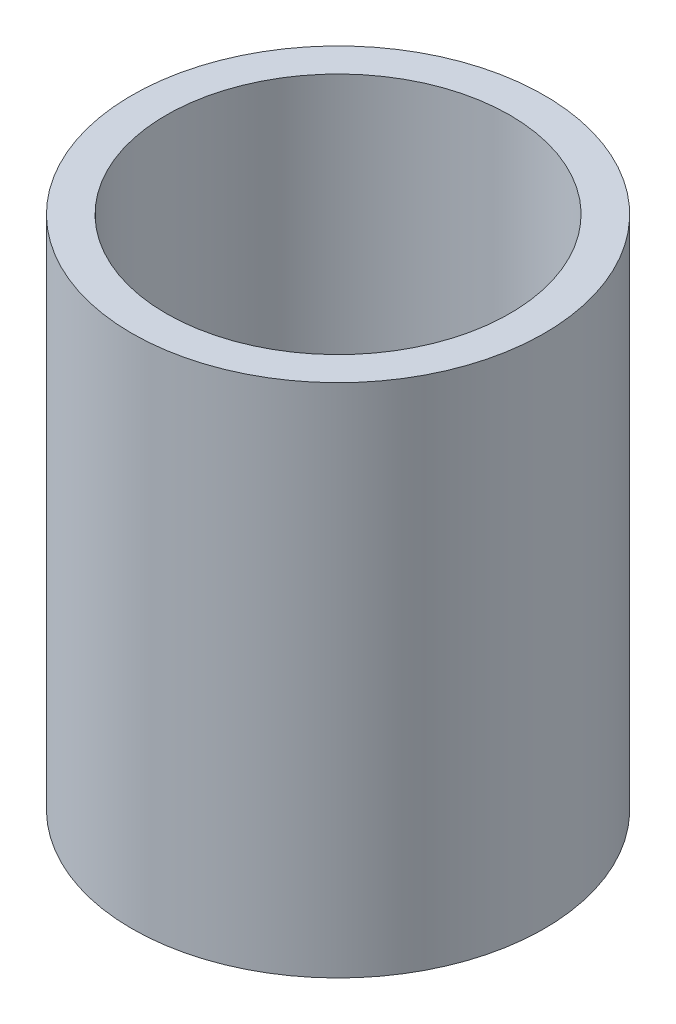
ISO-10303-21;
HEADER;
FILE_DESCRIPTION(('STEP AP214'),'2;1');
FILE_NAME('part.step','',(''),(''),'','','');
FILE_SCHEMA(('AUTOMOTIVE_DESIGN { 1 0 10303 214 1 1 1 1 }'));
ENDSEC;
DATA;
#1=APPLICATION_CONTEXT('core data for automotive mechanical design processes');
#2=APPLICATION_PROTOCOL_DEFINITION('international standard','automotive_design',2000,#1);
#3=PRODUCT_CONTEXT('',#1,'mechanical');
#4=PRODUCT('Part','Part','',(#3));
#5=PRODUCT_RELATED_PRODUCT_CATEGORY('part','',(#4));
#6=PRODUCT_DEFINITION_FORMATION('','',#4);
#7=PRODUCT_DEFINITION_CONTEXT('part definition',#1,'design');
#8=PRODUCT_DEFINITION('design','',#6,#7);
#9=PRODUCT_DEFINITION_SHAPE('','',#8);
#10=(LENGTH_UNIT() NAMED_UNIT(*) SI_UNIT(.MILLI.,.METRE.));
#11=(NAMED_UNIT(*) PLANE_ANGLE_UNIT() SI_UNIT($,.RADIAN.));
#12=(NAMED_UNIT(*) SI_UNIT($,.STERADIAN.) SOLID_ANGLE_UNIT());
#13=UNCERTAINTY_MEASURE_WITH_UNIT(LENGTH_MEASURE(1.E-05),#10,'distance_accuracy_value','');
#14=(GEOMETRIC_REPRESENTATION_CONTEXT(3) GLOBAL_UNCERTAINTY_ASSIGNED_CONTEXT((#13)) GLOBAL_UNIT_ASSIGNED_CONTEXT((#10,
#11,#12)) REPRESENTATION_CONTEXT('',''));
#15=CARTESIAN_POINT('',(0.,0.,0.));
#16=DIRECTION('',(0.,0.,1.));
#17=DIRECTION('',(1.,0.,0.));
#18=AXIS2_PLACEMENT_3D('',#15,#16,#17);
#19=CARTESIAN_POINT('',(0.,150.,0.));
#20=DIRECTION('',(0.,-1.,0.));
#21=DIRECTION('',(0.,0.,-1.));
#22=AXIS2_PLACEMENT_3D('',#19,#20,#21);
#23=CYLINDRICAL_SURFACE('',#22,60.);
#24=CARTESIAN_POINT('',(0.,150.,0.));
#25=DIRECTION('',(0.,1.,0.));
#26=DIRECTION('',(0.,0.,1.));
#27=AXIS2_PLACEMENT_3D('',#24,#25,#26);
#28=CIRCLE('',#27,60.);
#29=CARTESIAN_POINT('',(0.,150.,60.));
#30=VERTEX_POINT('',#29);
#31=EDGE_CURVE('E10',#30,#30,#28,.T.);
#32=ORIENTED_EDGE('',*,*,#31,.F.);
#33=EDGE_LOOP('',(#32));
#34=FACE_BOUND('',#33,.T.);
#35=CARTESIAN_POINT('',(0.,0.,0.));
#36=DIRECTION('',(0.,1.,0.));
#37=DIRECTION('',(0.,0.,1.));
#38=AXIS2_PLACEMENT_3D('',#35,#36,#37);
#39=CIRCLE('',#38,60.);
#40=CARTESIAN_POINT('',(0.,0.,60.));
#41=VERTEX_POINT('',#40);
#42=EDGE_CURVE('E34',#41,#41,#39,.T.);
#43=ORIENTED_EDGE('',*,*,#42,.T.);
#44=EDGE_LOOP('',(#43));
#45=FACE_BOUND('',#44,.T.);
#46=ADVANCED_FACE('F31',(#34,#45),#23,.T.);
#47=CARTESIAN_POINT('',(0.,150.,0.));
#48=DIRECTION('',(0.,1.,0.));
#49=DIRECTION('',(0.,0.,1.));
#50=AXIS2_PLACEMENT_3D('',#47,#48,#49);
#51=PLANE('',#50);
#52=CARTESIAN_POINT('',(0.,150.,0.));
#53=DIRECTION('',(0.,1.,0.));
#54=DIRECTION('',(0.,0.,1.));
#55=AXIS2_PLACEMENT_3D('',#52,#53,#54);
#56=CIRCLE('',#55,50.);
#57=CARTESIAN_POINT('',(0.,150.,50.));
#58=VERTEX_POINT('',#57);
#59=EDGE_CURVE('E43',#58,#58,#56,.T.);
#60=ORIENTED_EDGE('',*,*,#59,.F.);
#61=EDGE_LOOP('',(#60));
#62=FACE_BOUND('',#61,.T.);
#63=ORIENTED_EDGE('',*,*,#31,.T.);
#64=EDGE_LOOP('',(#63));
#65=FACE_BOUND('',#64,.T.);
#66=ADVANCED_FACE('F58',(#62,#65),#51,.T.);
#67=CARTESIAN_POINT('',(0.,0.,0.));
#68=DIRECTION('',(0.,1.,0.));
#69=DIRECTION('',(0.,0.,1.));
#70=AXIS2_PLACEMENT_3D('',#67,#68,#69);
#71=PLANE('',#70);
#72=ORIENTED_EDGE('',*,*,#42,.F.);
#73=EDGE_LOOP('',(#72));
#74=FACE_BOUND('',#73,.T.);
#75=ADVANCED_FACE('F54',(#74),#71,.F.);
#76=CARTESIAN_POINT('',(0.,20.,0.));
#77=DIRECTION('',(0.,1.,0.));
#78=DIRECTION('',(0.,0.,1.));
#79=AXIS2_PLACEMENT_3D('',#76,#77,#78);
#80=CYLINDRICAL_SURFACE('',#79,50.);
#81=CARTESIAN_POINT('',(0.,20.,0.));
#82=DIRECTION('',(0.,1.,0.));
#83=DIRECTION('',(0.,0.,1.));
#84=AXIS2_PLACEMENT_3D('',#81,#82,#83);
#85=CIRCLE('',#84,50.);
#86=CARTESIAN_POINT('',(0.,20.,50.));
#87=VERTEX_POINT('',#86);
#88=EDGE_CURVE('E41',#87,#87,#85,.T.);
#89=ORIENTED_EDGE('',*,*,#88,.F.);
#90=EDGE_LOOP('',(#89));
#91=FACE_BOUND('',#90,.T.);
#92=ORIENTED_EDGE('',*,*,#59,.T.);
#93=EDGE_LOOP('',(#92));
#94=FACE_BOUND('',#93,.T.);
#95=ADVANCED_FACE('F51',(#91,#94),#80,.F.);
#96=CARTESIAN_POINT('',(0.,20.,0.));
#97=DIRECTION('',(0.,1.,0.));
#98=DIRECTION('',(0.,0.,1.));
#99=AXIS2_PLACEMENT_3D('',#96,#97,#98);
#100=PLANE('',#99);
#101=ORIENTED_EDGE('',*,*,#88,.T.);
#102=EDGE_LOOP('',(#101));
#103=FACE_BOUND('',#102,.T.);
#104=ADVANCED_FACE('F49',(#103),#100,.T.);
#105=CLOSED_SHELL('',(#46,#66,#75,#95,#104));
#106=MANIFOLD_SOLID_BREP('B2',#105);
#107=ADVANCED_BREP_SHAPE_REPRESENTATION('',(#18,#106),#14);
#108=SHAPE_DEFINITION_REPRESENTATION(#9,#107);
ENDSEC;
END-ISO-10303-21;
